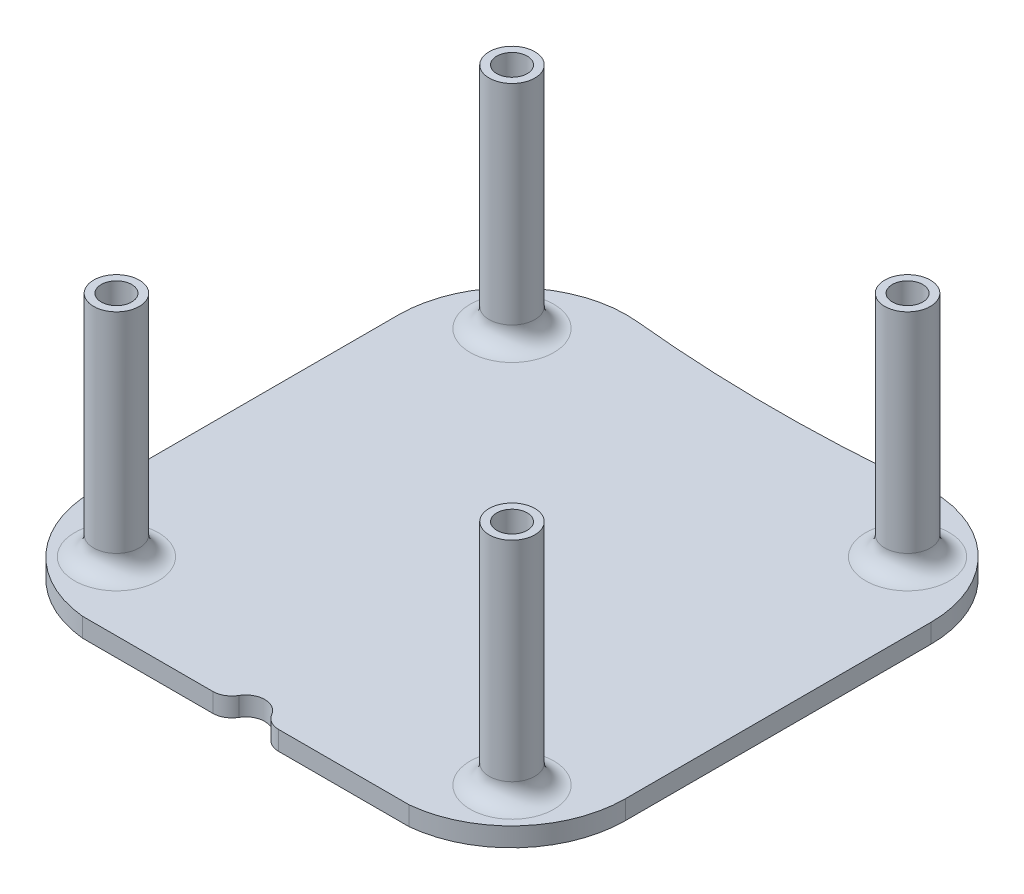
ISO-10303-21;
HEADER;
FILE_DESCRIPTION(('STEP AP214'),'2;1');
FILE_NAME('part.step','',(''),(''),'','','');
FILE_SCHEMA(('AUTOMOTIVE_DESIGN { 1 0 10303 214 1 1 1 1 }'));
ENDSEC;
DATA;
#1=APPLICATION_CONTEXT('core data for automotive mechanical design processes');
#2=APPLICATION_PROTOCOL_DEFINITION('international standard','automotive_design',2000,#1);
#3=PRODUCT_CONTEXT('',#1,'mechanical');
#4=PRODUCT('Part','Part','',(#3));
#5=PRODUCT_RELATED_PRODUCT_CATEGORY('part','',(#4));
#6=PRODUCT_DEFINITION_FORMATION('','',#4);
#7=PRODUCT_DEFINITION_CONTEXT('part definition',#1,'design');
#8=PRODUCT_DEFINITION('design','',#6,#7);
#9=PRODUCT_DEFINITION_SHAPE('','',#8);
#10=(LENGTH_UNIT() NAMED_UNIT(*) SI_UNIT(.MILLI.,.METRE.));
#11=(NAMED_UNIT(*) PLANE_ANGLE_UNIT() SI_UNIT($,.RADIAN.));
#12=(NAMED_UNIT(*) SI_UNIT($,.STERADIAN.) SOLID_ANGLE_UNIT());
#13=UNCERTAINTY_MEASURE_WITH_UNIT(LENGTH_MEASURE(1.E-05),#10,'distance_accuracy_value','');
#14=(GEOMETRIC_REPRESENTATION_CONTEXT(3) GLOBAL_UNCERTAINTY_ASSIGNED_CONTEXT((#13)) GLOBAL_UNIT_ASSIGNED_CONTEXT((#10,
#11,#12)) REPRESENTATION_CONTEXT('',''));
#15=CARTESIAN_POINT('',(0.,0.,0.));
#16=DIRECTION('',(0.,0.,1.));
#17=DIRECTION('',(1.,0.,0.));
#18=AXIS2_PLACEMENT_3D('',#15,#16,#17);
#19=CARTESIAN_POINT('',(-53.5088233519313,5.,72.0967377081992));
#20=DIRECTION('',(0.,0.,-1.));
#21=DIRECTION('',(-1.,0.,0.));
#22=AXIS2_PLACEMENT_3D('',#19,#20,#21);
#23=PLANE('',#22);
#24=DIRECTION('',(1.,0.,0.));
#25=VECTOR('',#24,1.);
#26=CARTESIAN_POINT('',(-53.5088233519313,0.,72.0967377081992));
#27=LINE('',#26,#25);
#28=CARTESIAN_POINT('',(-53.5088233519317,0.,72.0967377082024));
#29=VERTEX_POINT('',#28);
#30=CARTESIAN_POINT('',(-19.1963428574455,0.,72.0967377081992));
#31=VERTEX_POINT('',#30);
#32=EDGE_CURVE('E209',#29,#31,#27,.T.);
#33=ORIENTED_EDGE('',*,*,#32,.T.);
#34=DIRECTION('',(0.,1.,0.));
#35=VECTOR('',#34,1.);
#36=CARTESIAN_POINT('',(-19.1963428574455,5.,72.0967377081992));
#37=LINE('',#36,#35);
#38=CARTESIAN_POINT('',(-19.1963428574455,5.,72.0967377081992));
#39=VERTEX_POINT('',#38);
#40=EDGE_CURVE('E193',#31,#39,#37,.T.);
#41=ORIENTED_EDGE('',*,*,#40,.T.);
#42=DIRECTION('',(1.,0.,0.));
#43=VECTOR('',#42,1.);
#44=CARTESIAN_POINT('',(-53.5088233519313,5.,72.0967377081992));
#45=LINE('',#44,#43);
#46=CARTESIAN_POINT('',(-53.5088233519317,5.,72.0967377082024));
#47=VERTEX_POINT('',#46);
#48=EDGE_CURVE('E226',#47,#39,#45,.T.);
#49=ORIENTED_EDGE('',*,*,#48,.F.);
#50=DIRECTION('',(0.,-1.,0.));
#51=VECTOR('',#50,1.);
#52=CARTESIAN_POINT('',(-53.5088233519317,5.,72.0967377082024));
#53=LINE('',#52,#51);
#54=EDGE_CURVE('E217',#47,#29,#53,.T.);
#55=ORIENTED_EDGE('',*,*,#54,.T.);
#56=EDGE_LOOP('',(#33,#41,#49,#55));
#57=FACE_BOUND('',#56,.T.);
#58=ADVANCED_FACE('F33',(#57),#23,.F.);
#59=CARTESIAN_POINT('',(-9.73972237320139,5.,-441.897920932281));
#60=DIRECTION('',(0.,-1.,0.));
#61=DIRECTION('',(0.,0.,-1.));
#62=AXIS2_PLACEMENT_3D('',#59,#60,#61);
#63=CYLINDRICAL_SURFACE('',#62,375.902423273394);
#64=CARTESIAN_POINT('',(-9.73972237320139,0.,-441.897920932281));
#65=DIRECTION('',(0.,-1.,0.));
#66=DIRECTION('',(0.,0.,-1.));
#67=AXIS2_PLACEMENT_3D('',#64,#65,#66);
#68=CIRCLE('',#67,375.902423273394);
#69=CARTESIAN_POINT('',(29.5159973798355,0.,-68.0508662568452));
#70=VERTEX_POINT('',#69);
#71=CARTESIAN_POINT('',(-47.5633542876603,0.,-67.9032622918008));
#72=VERTEX_POINT('',#71);
#73=EDGE_CURVE('E147',#70,#72,#68,.T.);
#74=ORIENTED_EDGE('',*,*,#73,.T.);
#75=DIRECTION('',(0.,-1.,0.));
#76=VECTOR('',#75,1.);
#77=CARTESIAN_POINT('',(-47.5633542876603,5.,-67.9032622918008));
#78=LINE('',#77,#76);
#79=CARTESIAN_POINT('',(-47.5633542876603,5.,-67.9032622918008));
#80=VERTEX_POINT('',#79);
#81=EDGE_CURVE('E126',#80,#72,#78,.T.);
#82=ORIENTED_EDGE('',*,*,#81,.F.);
#83=CARTESIAN_POINT('',(-9.73972237320139,5.,-441.897920932281));
#84=DIRECTION('',(0.,-1.,0.));
#85=DIRECTION('',(0.,0.,-1.));
#86=AXIS2_PLACEMENT_3D('',#83,#84,#85);
#87=CIRCLE('',#86,375.902423273394);
#88=CARTESIAN_POINT('',(29.5159973798355,5.,-68.0508662568452));
#89=VERTEX_POINT('',#88);
#90=EDGE_CURVE('E133',#89,#80,#87,.T.);
#91=ORIENTED_EDGE('',*,*,#90,.F.);
#92=DIRECTION('',(0.,-1.,0.));
#93=VECTOR('',#92,1.);
#94=CARTESIAN_POINT('',(29.5159973798355,5.,-68.0508662568452));
#95=LINE('',#94,#93);
#96=EDGE_CURVE('E287',#89,#70,#95,.T.);
#97=ORIENTED_EDGE('',*,*,#96,.T.);
#98=EDGE_LOOP('',(#74,#82,#91,#97));
#99=FACE_BOUND('',#98,.T.);
#100=ADVANCED_FACE('F145',(#99),#63,.F.);
#101=CARTESIAN_POINT('',(-50.5360888196258,5.,-38.0509114731055));
#102=DIRECTION('',(0.,-1.,0.));
#103=DIRECTION('',(0.,0.,-1.));
#104=AXIS2_PLACEMENT_3D('',#101,#102,#103);
#105=CYLINDRICAL_SURFACE('',#104,30.);
#106=CARTESIAN_POINT('',(-50.5360888196258,0.,-38.0509114731055));
#107=DIRECTION('',(0.,1.,0.));
#108=DIRECTION('',(0.,0.,1.));
#109=AXIS2_PLACEMENT_3D('',#106,#107,#108);
#110=CIRCLE('',#109,30.);
#111=CARTESIAN_POINT('',(-80.5360888196258,0.,-38.0509114730991));
#112=VERTEX_POINT('',#111);
#113=EDGE_CURVE('E289',#72,#112,#110,.T.);
#114=ORIENTED_EDGE('',*,*,#113,.T.);
#115=DIRECTION('',(0.,-1.,0.));
#116=VECTOR('',#115,1.);
#117=CARTESIAN_POINT('',(-80.5360888196258,5.,-38.0509114730991));
#118=LINE('',#117,#116);
#119=CARTESIAN_POINT('',(-80.5360888196258,5.,-38.0509114730991));
#120=VERTEX_POINT('',#119);
#121=EDGE_CURVE('E129',#120,#112,#118,.T.);
#122=ORIENTED_EDGE('',*,*,#121,.F.);
#123=CARTESIAN_POINT('',(-50.5360888196258,5.,-38.0509114731055));
#124=DIRECTION('',(0.,1.,0.));
#125=DIRECTION('',(0.,0.,1.));
#126=AXIS2_PLACEMENT_3D('',#123,#124,#125);
#127=CIRCLE('',#126,30.);
#128=EDGE_CURVE('E122',#80,#120,#127,.T.);
#129=ORIENTED_EDGE('',*,*,#128,.F.);
#130=ORIENTED_EDGE('',*,*,#81,.T.);
#131=EDGE_LOOP('',(#114,#122,#129,#130));
#132=FACE_BOUND('',#131,.T.);
#133=ADVANCED_FACE('F124',(#132),#105,.T.);
#134=CARTESIAN_POINT('',(-80.5360888196258,5.,42.2443868895377));
#135=DIRECTION('',(1.,0.,0.));
#136=DIRECTION('',(0.,0.,-1.));
#137=AXIS2_PLACEMENT_3D('',#134,#135,#136);
#138=PLANE('',#137);
#139=DIRECTION('',(0.,0.,1.));
#140=VECTOR('',#139,1.);
#141=CARTESIAN_POINT('',(-80.5360888196258,0.,42.2443868895377));
#142=LINE('',#141,#140);
#143=CARTESIAN_POINT('',(-80.5360888196258,0.,42.2443868895377));
#144=VERTEX_POINT('',#143);
#145=EDGE_CURVE('E291',#112,#144,#142,.T.);
#146=ORIENTED_EDGE('',*,*,#145,.T.);
#147=DIRECTION('',(0.,-1.,0.));
#148=VECTOR('',#147,1.);
#149=CARTESIAN_POINT('',(-80.5360888196258,5.,42.2443868895377));
#150=LINE('',#149,#148);
#151=CARTESIAN_POINT('',(-80.5360888196258,5.,42.2443868895377));
#152=VERTEX_POINT('',#151);
#153=EDGE_CURVE('E153',#152,#144,#150,.T.);
#154=ORIENTED_EDGE('',*,*,#153,.F.);
#155=DIRECTION('',(0.,0.,1.));
#156=VECTOR('',#155,1.);
#157=CARTESIAN_POINT('',(-80.5360888196258,5.,42.2443868895377));
#158=LINE('',#157,#156);
#159=EDGE_CURVE('E132',#120,#152,#158,.T.);
#160=ORIENTED_EDGE('',*,*,#159,.F.);
#161=ORIENTED_EDGE('',*,*,#121,.T.);
#162=EDGE_LOOP('',(#146,#154,#160,#161));
#163=FACE_BOUND('',#162,.T.);
#164=ADVANCED_FACE('F316',(#163),#138,.F.);
#165=CARTESIAN_POINT('',(-50.5360888196258,5.,42.2443868895441));
#166=DIRECTION('',(0.,-1.,0.));
#167=DIRECTION('',(0.,0.,-1.));
#168=AXIS2_PLACEMENT_3D('',#165,#166,#167);
#169=CYLINDRICAL_SURFACE('',#168,29.9999999999968);
#170=CARTESIAN_POINT('',(-50.5360888196258,0.,42.2443868895441));
#171=DIRECTION('',(0.,1.,0.));
#172=DIRECTION('',(0.,0.,-1.));
#173=AXIS2_PLACEMENT_3D('',#170,#171,#172);
#174=CIRCLE('',#173,29.9999999999968);
#175=EDGE_CURVE('E293',#144,#29,#174,.T.);
#176=ORIENTED_EDGE('',*,*,#175,.T.);
#177=ORIENTED_EDGE('',*,*,#54,.F.);
#178=CARTESIAN_POINT('',(-50.5360888196258,5.,42.2443868895441));
#179=DIRECTION('',(0.,1.,0.));
#180=DIRECTION('',(0.,0.,-1.));
#181=AXIS2_PLACEMENT_3D('',#178,#179,#180);
#182=CIRCLE('',#181,29.9999999999968);
#183=EDGE_CURVE('E278',#152,#47,#182,.T.);
#184=ORIENTED_EDGE('',*,*,#183,.F.);
#185=ORIENTED_EDGE('',*,*,#153,.T.);
#186=EDGE_LOOP('',(#176,#177,#184,#185));
#187=FACE_BOUND('',#186,.T.);
#188=ADVANCED_FACE('F313',(#187),#169,.T.);
#189=CARTESIAN_POINT('',(-1.87583478175963,5.,72.0967377081992));
#190=VERTEX_POINT('',#189);
#191=CARTESIAN_POINT('',(32.4366457127266,5.,72.0967377081992));
#192=VERTEX_POINT('',#191);
#193=EDGE_CURVE('E280',#190,#192,#45,.T.);
#194=ORIENTED_EDGE('',*,*,#193,.F.);
#195=DIRECTION('',(0.,1.,0.));
#196=VECTOR('',#195,1.);
#197=CARTESIAN_POINT('',(-1.87583478175963,5.,72.0967377081992));
#198=LINE('',#197,#196);
#199=CARTESIAN_POINT('',(-1.87583478175963,0.,72.0967377081992));
#200=VERTEX_POINT('',#199);
#201=EDGE_CURVE('E11',#190,#200,#198,.F.);
#202=ORIENTED_EDGE('',*,*,#201,.T.);
#203=CARTESIAN_POINT('',(32.4366457127266,0.,72.0967377081992));
#204=VERTEX_POINT('',#203);
#205=EDGE_CURVE('E219',#200,#204,#27,.T.);
#206=ORIENTED_EDGE('',*,*,#205,.T.);
#207=DIRECTION('',(0.,-1.,0.));
#208=VECTOR('',#207,1.);
#209=CARTESIAN_POINT('',(32.4366457127266,5.,72.0967377081992));
#210=LINE('',#209,#208);
#211=EDGE_CURVE('E306',#192,#204,#210,.T.);
#212=ORIENTED_EDGE('',*,*,#211,.F.);
#213=EDGE_LOOP('',(#194,#202,#206,#212));
#214=FACE_BOUND('',#213,.T.);
#215=ADVANCED_FACE('F323',(#214),#23,.F.);
#216=CARTESIAN_POINT('',(29.463911180421,5.,42.2443868895377));
#217=DIRECTION('',(0.,-1.,0.));
#218=DIRECTION('',(0.,0.,-1.));
#219=AXIS2_PLACEMENT_3D('',#216,#217,#218);
#220=CYLINDRICAL_SURFACE('',#219,29.9999999999766);
#221=CARTESIAN_POINT('',(29.463911180421,0.,42.2443868895377));
#222=DIRECTION('',(0.,1.,0.));
#223=DIRECTION('',(0.,0.,-1.));
#224=AXIS2_PLACEMENT_3D('',#221,#222,#223);
#225=CIRCLE('',#224,29.9999999999766);
#226=CARTESIAN_POINT('',(59.4639111803976,0.,42.2443868895377));
#227=VERTEX_POINT('',#226);
#228=EDGE_CURVE('E218',#204,#227,#225,.T.);
#229=ORIENTED_EDGE('',*,*,#228,.T.);
#230=DIRECTION('',(0.,-1.,0.));
#231=VECTOR('',#230,1.);
#232=CARTESIAN_POINT('',(59.4639111803976,5.,42.2443868895377));
#233=LINE('',#232,#231);
#234=CARTESIAN_POINT('',(59.4639111803976,5.,42.2443868895377));
#235=VERTEX_POINT('',#234);
#236=EDGE_CURVE('E303',#235,#227,#233,.T.);
#237=ORIENTED_EDGE('',*,*,#236,.F.);
#238=CARTESIAN_POINT('',(29.463911180421,5.,42.2443868895377));
#239=DIRECTION('',(0.,1.,0.));
#240=DIRECTION('',(0.,0.,-1.));
#241=AXIS2_PLACEMENT_3D('',#238,#239,#240);
#242=CIRCLE('',#241,29.9999999999766);
#243=EDGE_CURVE('E282',#192,#235,#242,.T.);
#244=ORIENTED_EDGE('',*,*,#243,.F.);
#245=ORIENTED_EDGE('',*,*,#211,.T.);
#246=EDGE_LOOP('',(#229,#237,#244,#245));
#247=FACE_BOUND('',#246,.T.);
#248=ADVANCED_FACE('F334',(#247),#220,.T.);
#249=CARTESIAN_POINT('',(59.4639111803742,5.,42.2443868895377));
#250=DIRECTION('',(-1.,0.,0.));
#251=DIRECTION('',(0.,0.,1.));
#252=AXIS2_PLACEMENT_3D('',#249,#250,#251);
#253=PLANE('',#252);
#254=DIRECTION('',(0.,0.,-1.));
#255=VECTOR('',#254,1.);
#256=CARTESIAN_POINT('',(59.4639111803742,0.,42.2443868895377));
#257=LINE('',#256,#255);
#258=CARTESIAN_POINT('',(59.4639111803742,0.,-38.0509114731055));
#259=VERTEX_POINT('',#258);
#260=EDGE_CURVE('E296',#227,#259,#257,.T.);
#261=ORIENTED_EDGE('',*,*,#260,.T.);
#262=DIRECTION('',(0.,-1.,0.));
#263=VECTOR('',#262,1.);
#264=CARTESIAN_POINT('',(59.4639111803742,5.,-38.0509114731055));
#265=LINE('',#264,#263);
#266=CARTESIAN_POINT('',(59.4639111803742,5.,-38.0509114731055));
#267=VERTEX_POINT('',#266);
#268=EDGE_CURVE('E300',#267,#259,#265,.T.);
#269=ORIENTED_EDGE('',*,*,#268,.F.);
#270=DIRECTION('',(0.,0.,-1.));
#271=VECTOR('',#270,1.);
#272=CARTESIAN_POINT('',(59.4639111803742,5.,42.2443868895377));
#273=LINE('',#272,#271);
#274=EDGE_CURVE('E284',#235,#267,#273,.T.);
#275=ORIENTED_EDGE('',*,*,#274,.F.);
#276=ORIENTED_EDGE('',*,*,#236,.T.);
#277=EDGE_LOOP('',(#261,#269,#275,#276));
#278=FACE_BOUND('',#277,.T.);
#279=ADVANCED_FACE('F339',(#278),#253,.F.);
#280=CARTESIAN_POINT('',(29.463911180421,5.,-38.0509114731055));
#281=DIRECTION('',(0.,-1.,0.));
#282=DIRECTION('',(0.,0.,-1.));
#283=AXIS2_PLACEMENT_3D('',#280,#281,#282);
#284=CYLINDRICAL_SURFACE('',#283,29.9999999999766);
#285=CARTESIAN_POINT('',(29.463911180421,0.,-38.0509114731055));
#286=DIRECTION('',(0.,1.,0.));
#287=DIRECTION('',(0.,0.,1.));
#288=AXIS2_PLACEMENT_3D('',#285,#286,#287);
#289=CIRCLE('',#288,29.9999999999766);
#290=EDGE_CURVE('E143',#259,#70,#289,.T.);
#291=ORIENTED_EDGE('',*,*,#290,.T.);
#292=ORIENTED_EDGE('',*,*,#96,.F.);
#293=CARTESIAN_POINT('',(29.463911180421,5.,-38.0509114731055));
#294=DIRECTION('',(0.,1.,0.));
#295=DIRECTION('',(0.,0.,1.));
#296=AXIS2_PLACEMENT_3D('',#293,#294,#295);
#297=CIRCLE('',#296,29.9999999999766);
#298=EDGE_CURVE('E139',#267,#89,#297,.T.);
#299=ORIENTED_EDGE('',*,*,#298,.F.);
#300=ORIENTED_EDGE('',*,*,#268,.T.);
#301=EDGE_LOOP('',(#291,#292,#299,#300));
#302=FACE_BOUND('',#301,.T.);
#303=ADVANCED_FACE('F433',(#302),#284,.T.);
#304=CARTESIAN_POINT('',(-9.73972237320139,5.,-441.897920932281));
#305=DIRECTION('',(0.,-1.,0.));
#306=DIRECTION('',(0.,0.,-1.));
#307=AXIS2_PLACEMENT_3D('',#304,#305,#306);
#308=PLANE('',#307);
#309=CARTESIAN_POINT('',(41.4639111803975,5.,54.0967377082193));
#310=DIRECTION('',(0.,-1.,0.));
#311=DIRECTION('',(0.,0.,-1.));
#312=AXIS2_PLACEMENT_3D('',#309,#310,#311);
#313=CIRCLE('',#312,11.);
#314=CARTESIAN_POINT('',(41.4639111803975,5.,43.0967377082193));
#315=VERTEX_POINT('',#314);
#316=EDGE_CURVE('E179',#315,#315,#313,.T.);
#317=ORIENTED_EDGE('',*,*,#316,.T.);
#318=EDGE_LOOP('',(#317));
#319=FACE_BOUND('',#318,.T.);
#320=CARTESIAN_POINT('',(-62.5360888196025,5.,54.0967377082193));
#321=DIRECTION('',(0.,-1.,0.));
#322=DIRECTION('',(0.,0.,-1.));
#323=AXIS2_PLACEMENT_3D('',#320,#321,#322);
#324=CIRCLE('',#323,11.);
#325=CARTESIAN_POINT('',(-62.5360888196025,5.,43.0967377082193));
#326=VERTEX_POINT('',#325);
#327=EDGE_CURVE('E176',#326,#326,#324,.T.);
#328=ORIENTED_EDGE('',*,*,#327,.T.);
#329=EDGE_LOOP('',(#328));
#330=FACE_BOUND('',#329,.T.);
#331=CARTESIAN_POINT('',(-62.5360888196025,5.,-49.9032622917807));
#332=DIRECTION('',(0.,-1.,0.));
#333=DIRECTION('',(0.,0.,-1.));
#334=AXIS2_PLACEMENT_3D('',#331,#332,#333);
#335=CIRCLE('',#334,11.);
#336=CARTESIAN_POINT('',(-62.5360888196025,5.,-60.9032622917807));
#337=VERTEX_POINT('',#336);
#338=EDGE_CURVE('E173',#337,#337,#335,.T.);
#339=ORIENTED_EDGE('',*,*,#338,.T.);
#340=EDGE_LOOP('',(#339));
#341=FACE_BOUND('',#340,.T.);
#342=CARTESIAN_POINT('',(41.4639111803974,5.,-49.9032622917807));
#343=DIRECTION('',(0.,-1.,0.));
#344=DIRECTION('',(0.,0.,-1.));
#345=AXIS2_PLACEMENT_3D('',#342,#343,#344);
#346=CIRCLE('',#345,11.);
#347=CARTESIAN_POINT('',(41.4639111803974,5.,-60.9032622917807));
#348=VERTEX_POINT('',#347);
#349=EDGE_CURVE('E151',#348,#348,#346,.T.);
#350=ORIENTED_EDGE('',*,*,#349,.T.);
#351=EDGE_LOOP('',(#350));
#352=FACE_BOUND('',#351,.T.);
#353=ORIENTED_EDGE('',*,*,#48,.T.);
#354=CARTESIAN_POINT('',(-19.1963428574455,5.,67.0967377081992));
#355=DIRECTION('',(0.,-1.,0.));
#356=DIRECTION('',(0.,0.,-1.));
#357=AXIS2_PLACEMENT_3D('',#354,#355,#356);
#358=CIRCLE('',#357,5.);
#359=CARTESIAN_POINT('',(-14.8662158385238,5.,69.5967377082001));
#360=VERTEX_POINT('',#359);
#361=EDGE_CURVE('E198',#39,#360,#358,.F.);
#362=ORIENTED_EDGE('',*,*,#361,.T.);
#363=CARTESIAN_POINT('',(-10.5360888196026,5.,72.0967377082008));
#364=DIRECTION('',(0.,1.,0.));
#365=DIRECTION('',(0.,0.,1.));
#366=AXIS2_PLACEMENT_3D('',#363,#364,#365);
#367=CIRCLE('',#366,4.99999999999954);
#368=CARTESIAN_POINT('',(-6.20596180068129,5.,69.5967377082001));
#369=VERTEX_POINT('',#368);
#370=EDGE_CURVE('E224',#369,#360,#367,.T.);
#371=ORIENTED_EDGE('',*,*,#370,.F.);
#372=CARTESIAN_POINT('',(-1.87583478175963,5.,67.0967377081992));
#373=DIRECTION('',(0.,-1.,0.));
#374=DIRECTION('',(0.,0.,-1.));
#375=AXIS2_PLACEMENT_3D('',#372,#373,#374);
#376=CIRCLE('',#375,5.);
#377=EDGE_CURVE('E196',#369,#190,#376,.F.);
#378=ORIENTED_EDGE('',*,*,#377,.T.);
#379=ORIENTED_EDGE('',*,*,#193,.T.);
#380=ORIENTED_EDGE('',*,*,#243,.T.);
#381=ORIENTED_EDGE('',*,*,#274,.T.);
#382=ORIENTED_EDGE('',*,*,#298,.T.);
#383=ORIENTED_EDGE('',*,*,#90,.T.);
#384=ORIENTED_EDGE('',*,*,#128,.T.);
#385=ORIENTED_EDGE('',*,*,#159,.T.);
#386=ORIENTED_EDGE('',*,*,#183,.T.);
#387=EDGE_LOOP('',(#353,#362,#371,#378,#379,#380,#381,#382,#383,#384,#385,#386));
#388=FACE_BOUND('',#387,.T.);
#389=ADVANCED_FACE('F137',(#319,#330,#341,#352,#388),#308,.F.);
#390=CARTESIAN_POINT('',(-9.73972237320139,0.,-441.897920932281));
#391=DIRECTION('',(0.,-1.,0.));
#392=DIRECTION('',(0.,0.,-1.));
#393=AXIS2_PLACEMENT_3D('',#390,#391,#392);
#394=PLANE('',#393);
#395=CARTESIAN_POINT('',(-10.5360888196026,0.,72.0967377082008));
#396=DIRECTION('',(0.,-1.,0.));
#397=DIRECTION('',(0.,0.,-1.));
#398=AXIS2_PLACEMENT_3D('',#395,#396,#397);
#399=CIRCLE('',#398,4.99999999999954);
#400=CARTESIAN_POINT('',(-14.8662158385238,0.,69.5967377082001));
#401=VERTEX_POINT('',#400);
#402=CARTESIAN_POINT('',(-6.20596180068129,0.,69.5967377082001));
#403=VERTEX_POINT('',#402);
#404=EDGE_CURVE('E191',#401,#403,#399,.T.);
#405=ORIENTED_EDGE('',*,*,#404,.F.);
#406=CARTESIAN_POINT('',(-19.1963428574455,0.,67.0967377081992));
#407=DIRECTION('',(0.,-1.,0.));
#408=DIRECTION('',(0.,0.,-1.));
#409=AXIS2_PLACEMENT_3D('',#406,#407,#408);
#410=CIRCLE('',#409,5.);
#411=EDGE_CURVE('E41',#401,#31,#410,.T.);
#412=ORIENTED_EDGE('',*,*,#411,.T.);
#413=ORIENTED_EDGE('',*,*,#32,.F.);
#414=ORIENTED_EDGE('',*,*,#175,.F.);
#415=ORIENTED_EDGE('',*,*,#145,.F.);
#416=ORIENTED_EDGE('',*,*,#113,.F.);
#417=ORIENTED_EDGE('',*,*,#73,.F.);
#418=ORIENTED_EDGE('',*,*,#290,.F.);
#419=ORIENTED_EDGE('',*,*,#260,.F.);
#420=ORIENTED_EDGE('',*,*,#228,.F.);
#421=ORIENTED_EDGE('',*,*,#205,.F.);
#422=CARTESIAN_POINT('',(-1.87583478175963,0.,67.0967377081992));
#423=DIRECTION('',(0.,-1.,0.));
#424=DIRECTION('',(0.,0.,-1.));
#425=AXIS2_PLACEMENT_3D('',#422,#423,#424);
#426=CIRCLE('',#425,5.);
#427=EDGE_CURVE('E48',#200,#403,#426,.T.);
#428=ORIENTED_EDGE('',*,*,#427,.T.);
#429=EDGE_LOOP('',(#405,#412,#413,#414,#415,#416,#417,#418,#419,#420,#421,#428));
#430=FACE_BOUND('',#429,.T.);
#431=ADVANCED_FACE('F207',(#430),#394,.T.);
#432=CARTESIAN_POINT('',(41.4639111803974,65.,-49.9032622917807));
#433=DIRECTION('',(0.,1.,0.));
#434=DIRECTION('',(0.,0.,1.));
#435=AXIS2_PLACEMENT_3D('',#432,#433,#434);
#436=PLANE('',#435);
#437=CARTESIAN_POINT('',(41.4639111803974,65.,-49.9032622917807));
#438=DIRECTION('',(0.,1.,0.));
#439=DIRECTION('',(0.,0.,1.));
#440=AXIS2_PLACEMENT_3D('',#437,#438,#439);
#441=CIRCLE('',#440,4.00000000000001);
#442=CARTESIAN_POINT('',(41.4639111803974,65.,-45.9032622917807));
#443=VERTEX_POINT('',#442);
#444=EDGE_CURVE('E238',#443,#443,#441,.T.);
#445=ORIENTED_EDGE('',*,*,#444,.F.);
#446=EDGE_LOOP('',(#445));
#447=FACE_BOUND('',#446,.T.);
#448=CARTESIAN_POINT('',(41.4639111803974,65.,-49.9032622917807));
#449=DIRECTION('',(0.,1.,0.));
#450=DIRECTION('',(0.,0.,1.));
#451=AXIS2_PLACEMENT_3D('',#448,#449,#450);
#452=CIRCLE('',#451,5.99999999999999);
#453=CARTESIAN_POINT('',(41.4639111803974,65.,-43.9032622917807));
#454=VERTEX_POINT('',#453);
#455=EDGE_CURVE('E274',#454,#454,#452,.T.);
#456=ORIENTED_EDGE('',*,*,#455,.T.);
#457=EDGE_LOOP('',(#456));
#458=FACE_BOUND('',#457,.T.);
#459=ADVANCED_FACE('F424',(#447,#458),#436,.T.);
#460=CARTESIAN_POINT('',(41.4639111803974,65.,-49.9032622917807));
#461=DIRECTION('',(0.,-1.,0.));
#462=DIRECTION('',(0.,0.,-1.));
#463=AXIS2_PLACEMENT_3D('',#460,#461,#462);
#464=CYLINDRICAL_SURFACE('',#463,5.99999999999999);
#465=CARTESIAN_POINT('',(41.4639111803974,10.,-49.9032622917807));
#466=DIRECTION('',(0.,-1.,0.));
#467=DIRECTION('',(0.,0.,-1.));
#468=AXIS2_PLACEMENT_3D('',#465,#466,#467);
#469=CIRCLE('',#468,5.99999999999999);
#470=CARTESIAN_POINT('',(41.4639111803974,10.,-55.9032622917807));
#471=VERTEX_POINT('',#470);
#472=EDGE_CURVE('E188',#471,#471,#469,.F.);
#473=ORIENTED_EDGE('',*,*,#472,.T.);
#474=EDGE_LOOP('',(#473));
#475=FACE_BOUND('',#474,.T.);
#476=ORIENTED_EDGE('',*,*,#455,.F.);
#477=EDGE_LOOP('',(#476));
#478=FACE_BOUND('',#477,.T.);
#479=ADVANCED_FACE('F419',(#475,#478),#464,.T.);
#480=CARTESIAN_POINT('',(-62.5360888196025,65.,-49.9032622917807));
#481=DIRECTION('',(0.,-1.,0.));
#482=DIRECTION('',(0.,0.,-1.));
#483=AXIS2_PLACEMENT_3D('',#480,#481,#482);
#484=PLANE('',#483);
#485=CARTESIAN_POINT('',(-62.5360888196025,65.,-49.9032622917807));
#486=DIRECTION('',(0.,1.,0.));
#487=DIRECTION('',(0.,0.,1.));
#488=AXIS2_PLACEMENT_3D('',#485,#486,#487);
#489=CIRCLE('',#488,4.00000000000002);
#490=CARTESIAN_POINT('',(-62.5360888196025,65.,-45.9032622917807));
#491=VERTEX_POINT('',#490);
#492=EDGE_CURVE('E239',#491,#491,#489,.T.);
#493=ORIENTED_EDGE('',*,*,#492,.F.);
#494=EDGE_LOOP('',(#493));
#495=FACE_BOUND('',#494,.T.);
#496=CARTESIAN_POINT('',(-62.5360888196025,65.,-49.9032622917807));
#497=DIRECTION('',(0.,1.,0.));
#498=DIRECTION('',(0.,0.,-1.));
#499=AXIS2_PLACEMENT_3D('',#496,#497,#498);
#500=CIRCLE('',#499,5.99999999999999);
#501=CARTESIAN_POINT('',(-62.5360888196025,65.,-55.9032622917807));
#502=VERTEX_POINT('',#501);
#503=EDGE_CURVE('E268',#502,#502,#500,.T.);
#504=ORIENTED_EDGE('',*,*,#503,.T.);
#505=EDGE_LOOP('',(#504));
#506=FACE_BOUND('',#505,.T.);
#507=ADVANCED_FACE('F416',(#495,#506),#484,.F.);
#508=CARTESIAN_POINT('',(-62.5360888196025,65.,-49.9032622917807));
#509=DIRECTION('',(0.,-1.,0.));
#510=DIRECTION('',(0.,0.,-1.));
#511=AXIS2_PLACEMENT_3D('',#508,#509,#510);
#512=CYLINDRICAL_SURFACE('',#511,5.99999999999999);
#513=CARTESIAN_POINT('',(-62.5360888196025,10.,-49.9032622917807));
#514=DIRECTION('',(0.,-1.,0.));
#515=DIRECTION('',(0.,0.,-1.));
#516=AXIS2_PLACEMENT_3D('',#513,#514,#515);
#517=CIRCLE('',#516,5.99999999999999);
#518=CARTESIAN_POINT('',(-62.5360888196025,10.,-55.9032622917807));
#519=VERTEX_POINT('',#518);
#520=EDGE_CURVE('E185',#519,#519,#517,.F.);
#521=ORIENTED_EDGE('',*,*,#520,.T.);
#522=EDGE_LOOP('',(#521));
#523=FACE_BOUND('',#522,.T.);
#524=ORIENTED_EDGE('',*,*,#503,.F.);
#525=EDGE_LOOP('',(#524));
#526=FACE_BOUND('',#525,.T.);
#527=ADVANCED_FACE('F409',(#523,#526),#512,.T.);
#528=CARTESIAN_POINT('',(-62.5360888196025,65.,54.0967377082193));
#529=DIRECTION('',(0.,1.,0.));
#530=DIRECTION('',(0.,0.,1.));
#531=AXIS2_PLACEMENT_3D('',#528,#529,#530);
#532=PLANE('',#531);
#533=CARTESIAN_POINT('',(-62.5360888196025,65.,54.0967377082193));
#534=DIRECTION('',(0.,1.,0.));
#535=DIRECTION('',(0.,0.,1.));
#536=AXIS2_PLACEMENT_3D('',#533,#534,#535);
#537=CIRCLE('',#536,4.00000000000002);
#538=CARTESIAN_POINT('',(-62.5360888196025,65.,58.0967377082193));
#539=VERTEX_POINT('',#538);
#540=EDGE_CURVE('E245',#539,#539,#537,.T.);
#541=ORIENTED_EDGE('',*,*,#540,.F.);
#542=EDGE_LOOP('',(#541));
#543=FACE_BOUND('',#542,.T.);
#544=CARTESIAN_POINT('',(-62.5360888196025,65.,54.0967377082193));
#545=DIRECTION('',(0.,1.,0.));
#546=DIRECTION('',(0.,0.,1.));
#547=AXIS2_PLACEMENT_3D('',#544,#545,#546);
#548=CIRCLE('',#547,5.99999999999999);
#549=CARTESIAN_POINT('',(-62.5360888196025,65.,60.0967377082193));
#550=VERTEX_POINT('',#549);
#551=EDGE_CURVE('E262',#550,#550,#548,.T.);
#552=ORIENTED_EDGE('',*,*,#551,.T.);
#553=EDGE_LOOP('',(#552));
#554=FACE_BOUND('',#553,.T.);
#555=ADVANCED_FACE('F394',(#543,#554),#532,.T.);
#556=CARTESIAN_POINT('',(-62.5360888196025,65.,54.0967377082193));
#557=DIRECTION('',(0.,-1.,0.));
#558=DIRECTION('',(0.,0.,-1.));
#559=AXIS2_PLACEMENT_3D('',#556,#557,#558);
#560=CYLINDRICAL_SURFACE('',#559,5.99999999999999);
#561=CARTESIAN_POINT('',(-62.5360888196025,10.,54.0967377082193));
#562=DIRECTION('',(0.,-1.,0.));
#563=DIRECTION('',(0.,0.,-1.));
#564=AXIS2_PLACEMENT_3D('',#561,#562,#563);
#565=CIRCLE('',#564,5.99999999999999);
#566=CARTESIAN_POINT('',(-62.5360888196025,10.,48.0967377082193));
#567=VERTEX_POINT('',#566);
#568=EDGE_CURVE('E182',#567,#567,#565,.F.);
#569=ORIENTED_EDGE('',*,*,#568,.T.);
#570=EDGE_LOOP('',(#569));
#571=FACE_BOUND('',#570,.T.);
#572=ORIENTED_EDGE('',*,*,#551,.F.);
#573=EDGE_LOOP('',(#572));
#574=FACE_BOUND('',#573,.T.);
#575=ADVANCED_FACE('F388',(#571,#574),#560,.T.);
#576=CARTESIAN_POINT('',(41.4639111803975,65.,54.0967377082193));
#577=DIRECTION('',(0.,-1.,0.));
#578=DIRECTION('',(0.,0.,-1.));
#579=AXIS2_PLACEMENT_3D('',#576,#577,#578);
#580=PLANE('',#579);
#581=CARTESIAN_POINT('',(41.4639111803975,65.,54.0967377082193));
#582=DIRECTION('',(0.,1.,0.));
#583=DIRECTION('',(0.,0.,1.));
#584=AXIS2_PLACEMENT_3D('',#581,#582,#583);
#585=CIRCLE('',#584,4.00000000000001);
#586=CARTESIAN_POINT('',(41.4639111803975,65.,58.0967377082193));
#587=VERTEX_POINT('',#586);
#588=EDGE_CURVE('E229',#587,#587,#585,.T.);
#589=ORIENTED_EDGE('',*,*,#588,.F.);
#590=EDGE_LOOP('',(#589));
#591=FACE_BOUND('',#590,.T.);
#592=CARTESIAN_POINT('',(41.4639111803975,65.,54.0967377082193));
#593=DIRECTION('',(0.,1.,0.));
#594=DIRECTION('',(0.,0.,-1.));
#595=AXIS2_PLACEMENT_3D('',#592,#593,#594);
#596=CIRCLE('',#595,5.99999999999999);
#597=CARTESIAN_POINT('',(41.4639111803975,65.,48.0967377082193));
#598=VERTEX_POINT('',#597);
#599=EDGE_CURVE('E256',#598,#598,#596,.T.);
#600=ORIENTED_EDGE('',*,*,#599,.T.);
#601=EDGE_LOOP('',(#600));
#602=FACE_BOUND('',#601,.T.);
#603=ADVANCED_FACE('F383',(#591,#602),#580,.F.);
#604=CARTESIAN_POINT('',(41.4639111803975,65.,54.0967377082193));
#605=DIRECTION('',(0.,-1.,0.));
#606=DIRECTION('',(0.,0.,-1.));
#607=AXIS2_PLACEMENT_3D('',#604,#605,#606);
#608=CYLINDRICAL_SURFACE('',#607,5.99999999999999);
#609=CARTESIAN_POINT('',(41.4639111803975,10.,54.0967377082193));
#610=DIRECTION('',(0.,-1.,0.));
#611=DIRECTION('',(0.,0.,-1.));
#612=AXIS2_PLACEMENT_3D('',#609,#610,#611);
#613=CIRCLE('',#612,5.99999999999999);
#614=CARTESIAN_POINT('',(41.4639111803975,10.,48.0967377082193));
#615=VERTEX_POINT('',#614);
#616=EDGE_CURVE('E148',#615,#615,#613,.F.);
#617=ORIENTED_EDGE('',*,*,#616,.T.);
#618=EDGE_LOOP('',(#617));
#619=FACE_BOUND('',#618,.T.);
#620=ORIENTED_EDGE('',*,*,#599,.F.);
#621=EDGE_LOOP('',(#620));
#622=FACE_BOUND('',#621,.T.);
#623=ADVANCED_FACE('F379',(#619,#622),#608,.T.);
#624=CARTESIAN_POINT('',(41.4639111803975,45.,54.0967377082193));
#625=DIRECTION('',(0.,1.,0.));
#626=DIRECTION('',(0.,0.,1.));
#627=AXIS2_PLACEMENT_3D('',#624,#625,#626);
#628=CYLINDRICAL_SURFACE('',#627,4.00000000000001);
#629=CARTESIAN_POINT('',(41.4639111803975,45.,54.0967377082193));
#630=DIRECTION('',(0.,1.,0.));
#631=DIRECTION('',(0.,0.,1.));
#632=AXIS2_PLACEMENT_3D('',#629,#630,#631);
#633=CIRCLE('',#632,4.00000000000001);
#634=CARTESIAN_POINT('',(41.4639111803975,45.,58.0967377082193));
#635=VERTEX_POINT('',#634);
#636=EDGE_CURVE('E232',#635,#635,#633,.T.);
#637=ORIENTED_EDGE('',*,*,#636,.F.);
#638=EDGE_LOOP('',(#637));
#639=FACE_BOUND('',#638,.T.);
#640=ORIENTED_EDGE('',*,*,#588,.T.);
#641=EDGE_LOOP('',(#640));
#642=FACE_BOUND('',#641,.T.);
#643=ADVANCED_FACE('F382',(#639,#642),#628,.F.);
#644=CARTESIAN_POINT('',(41.4639111803975,45.,54.0967377082193));
#645=DIRECTION('',(0.,1.,0.));
#646=DIRECTION('',(0.,0.,1.));
#647=AXIS2_PLACEMENT_3D('',#644,#645,#646);
#648=PLANE('',#647);
#649=CARTESIAN_POINT('',(41.4639111803975,45.,54.0967377082193));
#650=DIRECTION('',(0.,1.,0.));
#651=DIRECTION('',(0.,0.,1.));
#652=AXIS2_PLACEMENT_3D('',#649,#650,#651);
#653=CIRCLE('',#652,2.);
#654=CARTESIAN_POINT('',(41.4639111803975,45.,56.0967377082193));
#655=VERTEX_POINT('',#654);
#656=EDGE_CURVE('E157',#655,#655,#653,.T.);
#657=ORIENTED_EDGE('',*,*,#656,.F.);
#658=EDGE_LOOP('',(#657));
#659=FACE_BOUND('',#658,.T.);
#660=ORIENTED_EDGE('',*,*,#636,.T.);
#661=EDGE_LOOP('',(#660));
#662=FACE_BOUND('',#661,.T.);
#663=ADVANCED_FACE('F625',(#659,#662),#648,.T.);
#664=CARTESIAN_POINT('',(-62.5360888196025,45.,54.0967377082193));
#665=DIRECTION('',(0.,1.,0.));
#666=DIRECTION('',(0.,0.,1.));
#667=AXIS2_PLACEMENT_3D('',#664,#665,#666);
#668=CYLINDRICAL_SURFACE('',#667,4.00000000000002);
#669=CARTESIAN_POINT('',(-62.5360888196025,45.,54.0967377082193));
#670=DIRECTION('',(0.,1.,0.));
#671=DIRECTION('',(0.,0.,1.));
#672=AXIS2_PLACEMENT_3D('',#669,#670,#671);
#673=CIRCLE('',#672,4.00000000000002);
#674=CARTESIAN_POINT('',(-62.5360888196025,45.,58.0967377082193));
#675=VERTEX_POINT('',#674);
#676=EDGE_CURVE('E242',#675,#675,#673,.T.);
#677=ORIENTED_EDGE('',*,*,#676,.F.);
#678=EDGE_LOOP('',(#677));
#679=FACE_BOUND('',#678,.T.);
#680=ORIENTED_EDGE('',*,*,#540,.T.);
#681=EDGE_LOOP('',(#680));
#682=FACE_BOUND('',#681,.T.);
#683=ADVANCED_FACE('F634',(#679,#682),#668,.F.);
#684=CARTESIAN_POINT('',(-62.5360888196025,45.,54.0967377082193));
#685=DIRECTION('',(0.,1.,0.));
#686=DIRECTION('',(0.,0.,1.));
#687=AXIS2_PLACEMENT_3D('',#684,#685,#686);
#688=PLANE('',#687);
#689=CARTESIAN_POINT('',(-62.5360888196025,45.,54.0967377082193));
#690=DIRECTION('',(0.,1.,0.));
#691=DIRECTION('',(0.,0.,1.));
#692=AXIS2_PLACEMENT_3D('',#689,#690,#691);
#693=CIRCLE('',#692,2.);
#694=CARTESIAN_POINT('',(-62.5360888196025,45.,56.0967377082193));
#695=VERTEX_POINT('',#694);
#696=EDGE_CURVE('E160',#695,#695,#693,.T.);
#697=ORIENTED_EDGE('',*,*,#696,.F.);
#698=EDGE_LOOP('',(#697));
#699=FACE_BOUND('',#698,.T.);
#700=ORIENTED_EDGE('',*,*,#676,.T.);
#701=EDGE_LOOP('',(#700));
#702=FACE_BOUND('',#701,.T.);
#703=ADVANCED_FACE('F643',(#699,#702),#688,.T.);
#704=CARTESIAN_POINT('',(-62.5360888196025,45.,-49.9032622917807));
#705=DIRECTION('',(0.,1.,0.));
#706=DIRECTION('',(0.,0.,1.));
#707=AXIS2_PLACEMENT_3D('',#704,#705,#706);
#708=CYLINDRICAL_SURFACE('',#707,4.00000000000002);
#709=CARTESIAN_POINT('',(-62.5360888196025,45.,-49.9032622917807));
#710=DIRECTION('',(0.,1.,0.));
#711=DIRECTION('',(0.,0.,1.));
#712=AXIS2_PLACEMENT_3D('',#709,#710,#711);
#713=CIRCLE('',#712,4.00000000000002);
#714=CARTESIAN_POINT('',(-62.5360888196025,45.,-45.9032622917807));
#715=VERTEX_POINT('',#714);
#716=EDGE_CURVE('E235',#715,#715,#713,.T.);
#717=ORIENTED_EDGE('',*,*,#716,.F.);
#718=EDGE_LOOP('',(#717));
#719=FACE_BOUND('',#718,.T.);
#720=ORIENTED_EDGE('',*,*,#492,.T.);
#721=EDGE_LOOP('',(#720));
#722=FACE_BOUND('',#721,.T.);
#723=ADVANCED_FACE('F652',(#719,#722),#708,.F.);
#724=CARTESIAN_POINT('',(-62.5360888196025,45.,-49.9032622917807));
#725=DIRECTION('',(0.,1.,0.));
#726=DIRECTION('',(0.,0.,1.));
#727=AXIS2_PLACEMENT_3D('',#724,#725,#726);
#728=PLANE('',#727);
#729=CARTESIAN_POINT('',(-62.5360888196025,45.,-49.9032622917807));
#730=DIRECTION('',(0.,1.,0.));
#731=DIRECTION('',(0.,0.,1.));
#732=AXIS2_PLACEMENT_3D('',#729,#730,#731);
#733=CIRCLE('',#732,2.);
#734=CARTESIAN_POINT('',(-62.5360888196025,45.,-47.9032622917807));
#735=VERTEX_POINT('',#734);
#736=EDGE_CURVE('E164',#735,#735,#733,.T.);
#737=ORIENTED_EDGE('',*,*,#736,.F.);
#738=EDGE_LOOP('',(#737));
#739=FACE_BOUND('',#738,.T.);
#740=ORIENTED_EDGE('',*,*,#716,.T.);
#741=EDGE_LOOP('',(#740));
#742=FACE_BOUND('',#741,.T.);
#743=ADVANCED_FACE('F661',(#739,#742),#728,.T.);
#744=CARTESIAN_POINT('',(41.4639111803974,45.,-49.9032622917807));
#745=DIRECTION('',(0.,1.,0.));
#746=DIRECTION('',(0.,0.,1.));
#747=AXIS2_PLACEMENT_3D('',#744,#745,#746);
#748=CYLINDRICAL_SURFACE('',#747,4.00000000000001);
#749=CARTESIAN_POINT('',(41.4639111803974,45.,-49.9032622917807));
#750=DIRECTION('',(0.,1.,0.));
#751=DIRECTION('',(0.,0.,1.));
#752=AXIS2_PLACEMENT_3D('',#749,#750,#751);
#753=CIRCLE('',#752,4.00000000000001);
#754=CARTESIAN_POINT('',(41.4639111803974,45.,-45.9032622917807));
#755=VERTEX_POINT('',#754);
#756=EDGE_CURVE('E161',#755,#755,#753,.T.);
#757=ORIENTED_EDGE('',*,*,#756,.F.);
#758=EDGE_LOOP('',(#757));
#759=FACE_BOUND('',#758,.T.);
#760=ORIENTED_EDGE('',*,*,#444,.T.);
#761=EDGE_LOOP('',(#760));
#762=FACE_BOUND('',#761,.T.);
#763=ADVANCED_FACE('F670',(#759,#762),#748,.F.);
#764=CARTESIAN_POINT('',(41.4639111803974,45.,-49.9032622917807));
#765=DIRECTION('',(0.,1.,0.));
#766=DIRECTION('',(0.,0.,1.));
#767=AXIS2_PLACEMENT_3D('',#764,#765,#766);
#768=PLANE('',#767);
#769=CARTESIAN_POINT('',(41.4639111803974,45.,-49.9032622917807));
#770=DIRECTION('',(0.,1.,0.));
#771=DIRECTION('',(0.,0.,1.));
#772=AXIS2_PLACEMENT_3D('',#769,#770,#771);
#773=CIRCLE('',#772,2.);
#774=CARTESIAN_POINT('',(41.4639111803974,45.,-47.9032622917807));
#775=VERTEX_POINT('',#774);
#776=EDGE_CURVE('E167',#775,#775,#773,.T.);
#777=ORIENTED_EDGE('',*,*,#776,.F.);
#778=EDGE_LOOP('',(#777));
#779=FACE_BOUND('',#778,.T.);
#780=ORIENTED_EDGE('',*,*,#756,.T.);
#781=EDGE_LOOP('',(#780));
#782=FACE_BOUND('',#781,.T.);
#783=ADVANCED_FACE('F579',(#779,#782),#768,.T.);
#784=CARTESIAN_POINT('',(41.4639111803975,5.,54.0967377082193));
#785=DIRECTION('',(0.,1.,0.));
#786=DIRECTION('',(0.,0.,-1.));
#787=AXIS2_PLACEMENT_3D('',#784,#785,#786);
#788=CIRCLE('',#787,2.);
#789=CARTESIAN_POINT('',(41.4639111803975,5.,52.0967377082193));
#790=VERTEX_POINT('',#789);
#791=EDGE_CURVE('E169',#790,#790,#788,.T.);
#792=ORIENTED_EDGE('',*,*,#791,.T.);
#793=EDGE_LOOP('',(#792));
#794=FACE_BOUND('',#793,.T.);
#795=ADVANCED_FACE('F435',(#794),#308,.F.);
#796=CARTESIAN_POINT('',(41.4639111803975,65.,54.0967377082193));
#797=DIRECTION('',(0.,-1.,0.));
#798=DIRECTION('',(0.,0.,-1.));
#799=AXIS2_PLACEMENT_3D('',#796,#797,#798);
#800=CYLINDRICAL_SURFACE('',#799,2.);
#801=ORIENTED_EDGE('',*,*,#791,.F.);
#802=EDGE_LOOP('',(#801));
#803=FACE_BOUND('',#802,.T.);
#804=ORIENTED_EDGE('',*,*,#656,.T.);
#805=EDGE_LOOP('',(#804));
#806=FACE_BOUND('',#805,.T.);
#807=ADVANCED_FACE('F399',(#803,#806),#800,.F.);
#808=CARTESIAN_POINT('',(-62.5360888196025,5.,54.0967377082193));
#809=DIRECTION('',(0.,1.,0.));
#810=DIRECTION('',(0.,0.,1.));
#811=AXIS2_PLACEMENT_3D('',#808,#809,#810);
#812=CIRCLE('',#811,2.);
#813=CARTESIAN_POINT('',(-62.5360888196025,5.,56.0967377082193));
#814=VERTEX_POINT('',#813);
#815=EDGE_CURVE('E259',#814,#814,#812,.T.);
#816=ORIENTED_EDGE('',*,*,#815,.T.);
#817=EDGE_LOOP('',(#816));
#818=FACE_BOUND('',#817,.T.);
#819=ADVANCED_FACE('F406',(#818),#308,.F.);
#820=CARTESIAN_POINT('',(-62.5360888196025,65.,54.0967377082193));
#821=DIRECTION('',(0.,-1.,0.));
#822=DIRECTION('',(0.,0.,-1.));
#823=AXIS2_PLACEMENT_3D('',#820,#821,#822);
#824=CYLINDRICAL_SURFACE('',#823,2.);
#825=ORIENTED_EDGE('',*,*,#815,.F.);
#826=EDGE_LOOP('',(#825));
#827=FACE_BOUND('',#826,.T.);
#828=ORIENTED_EDGE('',*,*,#696,.T.);
#829=EDGE_LOOP('',(#828));
#830=FACE_BOUND('',#829,.T.);
#831=ADVANCED_FACE('F402',(#827,#830),#824,.F.);
#832=CARTESIAN_POINT('',(-62.5360888196025,5.,-49.9032622917807));
#833=DIRECTION('',(0.,1.,0.));
#834=DIRECTION('',(0.,0.,-1.));
#835=AXIS2_PLACEMENT_3D('',#832,#833,#834);
#836=CIRCLE('',#835,2.);
#837=CARTESIAN_POINT('',(-62.5360888196025,5.,-51.9032622917807));
#838=VERTEX_POINT('',#837);
#839=EDGE_CURVE('E265',#838,#838,#836,.T.);
#840=ORIENTED_EDGE('',*,*,#839,.T.);
#841=EDGE_LOOP('',(#840));
#842=FACE_BOUND('',#841,.T.);
#843=ADVANCED_FACE('F405',(#842),#308,.F.);
#844=CARTESIAN_POINT('',(-62.5360888196025,65.,-49.9032622917807));
#845=DIRECTION('',(0.,-1.,0.));
#846=DIRECTION('',(0.,0.,-1.));
#847=AXIS2_PLACEMENT_3D('',#844,#845,#846);
#848=CYLINDRICAL_SURFACE('',#847,2.);
#849=ORIENTED_EDGE('',*,*,#839,.F.);
#850=EDGE_LOOP('',(#849));
#851=FACE_BOUND('',#850,.T.);
#852=ORIENTED_EDGE('',*,*,#736,.T.);
#853=EDGE_LOOP('',(#852));
#854=FACE_BOUND('',#853,.T.);
#855=ADVANCED_FACE('F412',(#851,#854),#848,.F.);
#856=CARTESIAN_POINT('',(41.4639111803974,5.,-49.9032622917807));
#857=DIRECTION('',(0.,1.,0.));
#858=DIRECTION('',(0.,0.,1.));
#859=AXIS2_PLACEMENT_3D('',#856,#857,#858);
#860=CIRCLE('',#859,2.);
#861=CARTESIAN_POINT('',(41.4639111803974,5.,-47.9032622917807));
#862=VERTEX_POINT('',#861);
#863=EDGE_CURVE('E271',#862,#862,#860,.T.);
#864=ORIENTED_EDGE('',*,*,#863,.T.);
#865=EDGE_LOOP('',(#864));
#866=FACE_BOUND('',#865,.T.);
#867=ADVANCED_FACE('F372',(#866),#308,.F.);
#868=CARTESIAN_POINT('',(41.4639111803974,65.,-49.9032622917807));
#869=DIRECTION('',(0.,-1.,0.));
#870=DIRECTION('',(0.,0.,-1.));
#871=AXIS2_PLACEMENT_3D('',#868,#869,#870);
#872=CYLINDRICAL_SURFACE('',#871,2.);
#873=ORIENTED_EDGE('',*,*,#863,.F.);
#874=EDGE_LOOP('',(#873));
#875=FACE_BOUND('',#874,.T.);
#876=ORIENTED_EDGE('',*,*,#776,.T.);
#877=EDGE_LOOP('',(#876));
#878=FACE_BOUND('',#877,.T.);
#879=ADVANCED_FACE('F367',(#875,#878),#872,.F.);
#880=CARTESIAN_POINT('',(41.4639111803975,10.,54.0967377082193));
#881=DIRECTION('',(0.,-1.,0.));
#882=DIRECTION('',(0.,0.,-1.));
#883=AXIS2_PLACEMENT_3D('',#880,#881,#882);
#884=TOROIDAL_SURFACE('',#883,11.,5.);
#885=ORIENTED_EDGE('',*,*,#316,.F.);
#886=EDGE_LOOP('',(#885));
#887=FACE_BOUND('',#886,.T.);
#888=ORIENTED_EDGE('',*,*,#616,.F.);
#889=EDGE_LOOP('',(#888));
#890=FACE_BOUND('',#889,.T.);
#891=ADVANCED_FACE('F364',(#887,#890),#884,.F.);
#892=CARTESIAN_POINT('',(-62.5360888196025,10.,54.0967377082193));
#893=DIRECTION('',(0.,-1.,0.));
#894=DIRECTION('',(0.,0.,-1.));
#895=AXIS2_PLACEMENT_3D('',#892,#893,#894);
#896=TOROIDAL_SURFACE('',#895,11.,5.);
#897=ORIENTED_EDGE('',*,*,#327,.F.);
#898=EDGE_LOOP('',(#897));
#899=FACE_BOUND('',#898,.T.);
#900=ORIENTED_EDGE('',*,*,#568,.F.);
#901=EDGE_LOOP('',(#900));
#902=FACE_BOUND('',#901,.T.);
#903=ADVANCED_FACE('F360',(#899,#902),#896,.F.);
#904=CARTESIAN_POINT('',(-62.5360888196025,10.,-49.9032622917807));
#905=DIRECTION('',(0.,-1.,0.));
#906=DIRECTION('',(0.,0.,-1.));
#907=AXIS2_PLACEMENT_3D('',#904,#905,#906);
#908=TOROIDAL_SURFACE('',#907,11.,5.);
#909=ORIENTED_EDGE('',*,*,#338,.F.);
#910=EDGE_LOOP('',(#909));
#911=FACE_BOUND('',#910,.T.);
#912=ORIENTED_EDGE('',*,*,#520,.F.);
#913=EDGE_LOOP('',(#912));
#914=FACE_BOUND('',#913,.T.);
#915=ADVANCED_FACE('F356',(#911,#914),#908,.F.);
#916=CARTESIAN_POINT('',(41.4639111803974,10.,-49.9032622917807));
#917=DIRECTION('',(0.,-1.,0.));
#918=DIRECTION('',(0.,0.,-1.));
#919=AXIS2_PLACEMENT_3D('',#916,#917,#918);
#920=TOROIDAL_SURFACE('',#919,11.,5.);
#921=ORIENTED_EDGE('',*,*,#349,.F.);
#922=EDGE_LOOP('',(#921));
#923=FACE_BOUND('',#922,.T.);
#924=ORIENTED_EDGE('',*,*,#472,.F.);
#925=EDGE_LOOP('',(#924));
#926=FACE_BOUND('',#925,.T.);
#927=ADVANCED_FACE('F351',(#923,#926),#920,.F.);
#928=CARTESIAN_POINT('',(-10.5360888196026,-5.,72.0967377082008));
#929=DIRECTION('',(0.,1.,0.));
#930=DIRECTION('',(0.,0.,1.));
#931=AXIS2_PLACEMENT_3D('',#928,#929,#930);
#932=CYLINDRICAL_SURFACE('',#931,4.99999999999954);
#933=ORIENTED_EDGE('',*,*,#370,.T.);
#934=DIRECTION('',(0.,1.,0.));
#935=VECTOR('',#934,1.);
#936=CARTESIAN_POINT('',(-14.8662158385238,-5.,69.5967377082001));
#937=LINE('',#936,#935);
#938=EDGE_CURVE('E202',#360,#401,#937,.F.);
#939=ORIENTED_EDGE('',*,*,#938,.T.);
#940=ORIENTED_EDGE('',*,*,#404,.T.);
#941=DIRECTION('',(0.,1.,0.));
#942=VECTOR('',#941,1.);
#943=CARTESIAN_POINT('',(-6.20596180068129,-5.,69.5967377082001));
#944=LINE('',#943,#942);
#945=EDGE_CURVE('E200',#403,#369,#944,.T.);
#946=ORIENTED_EDGE('',*,*,#945,.T.);
#947=EDGE_LOOP('',(#933,#939,#940,#946));
#948=FACE_BOUND('',#947,.T.);
#949=ADVANCED_FACE('F228',(#948),#932,.F.);
#950=CARTESIAN_POINT('',(-19.1963428574455,-5.,67.0967377081992));
#951=DIRECTION('',(0.,1.,0.));
#952=DIRECTION('',(0.,0.,1.));
#953=AXIS2_PLACEMENT_3D('',#950,#951,#952);
#954=CYLINDRICAL_SURFACE('',#953,5.);
#955=ORIENTED_EDGE('',*,*,#411,.F.);
#956=ORIENTED_EDGE('',*,*,#938,.F.);
#957=ORIENTED_EDGE('',*,*,#361,.F.);
#958=ORIENTED_EDGE('',*,*,#40,.F.);
#959=EDGE_LOOP('',(#955,#956,#957,#958));
#960=FACE_BOUND('',#959,.T.);
#961=ADVANCED_FACE('F221',(#960),#954,.T.);
#962=CARTESIAN_POINT('',(-1.87583478175963,-5.,67.0967377081992));
#963=DIRECTION('',(0.,1.,0.));
#964=DIRECTION('',(0.,0.,1.));
#965=AXIS2_PLACEMENT_3D('',#962,#963,#964);
#966=CYLINDRICAL_SURFACE('',#965,5.);
#967=ORIENTED_EDGE('',*,*,#377,.F.);
#968=ORIENTED_EDGE('',*,*,#945,.F.);
#969=ORIENTED_EDGE('',*,*,#427,.F.);
#970=ORIENTED_EDGE('',*,*,#201,.F.);
#971=EDGE_LOOP('',(#967,#968,#969,#970));
#972=FACE_BOUND('',#971,.T.);
#973=ADVANCED_FACE('F35',(#972),#966,.T.);
#974=CLOSED_SHELL('',(#58,#100,#133,#164,#188,#215,#248,#279,#303,#389,#431,#459,#479,#507,#527,
#555,#575,#603,#623,#643,#663,#683,#703,#723,#743,#763,#783,#795,#807,#819,#831,#843,#855,#867,
#879,#891,#903,#915,#927,#949,#961,#973));
#975=MANIFOLD_SOLID_BREP('B2',#974);
#976=ADVANCED_BREP_SHAPE_REPRESENTATION('',(#18,#975),#14);
#977=SHAPE_DEFINITION_REPRESENTATION(#9,#976);
ENDSEC;
END-ISO-10303-21;
